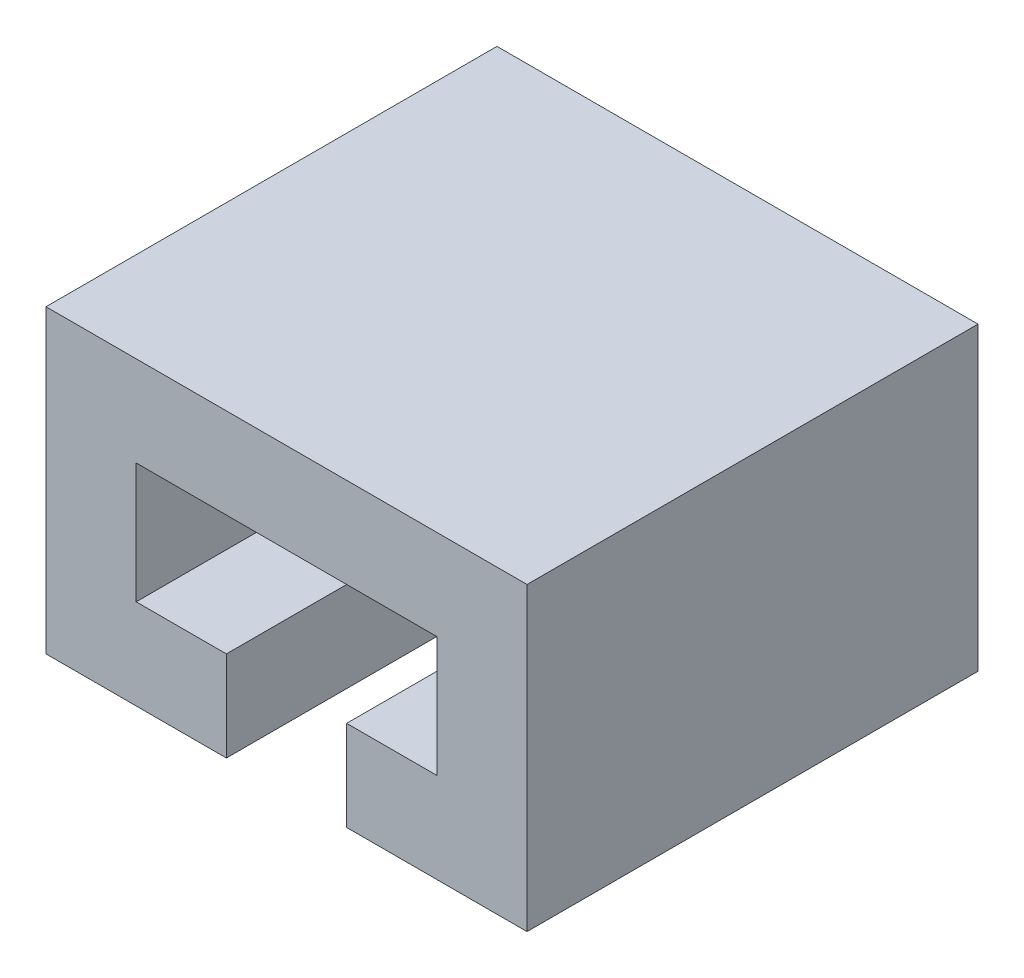
ISO-10303-21;
HEADER;
FILE_DESCRIPTION(('STEP AP214'),'2;1');
FILE_NAME('part.step','',(''),(''),'','','');
FILE_SCHEMA(('AUTOMOTIVE_DESIGN { 1 0 10303 214 1 1 1 1 }'));
ENDSEC;
DATA;
#1=APPLICATION_CONTEXT('core data for automotive mechanical design processes');
#2=APPLICATION_PROTOCOL_DEFINITION('international standard','automotive_design',2000,#1);
#3=PRODUCT_CONTEXT('',#1,'mechanical');
#4=PRODUCT('Part','Part','',(#3));
#5=PRODUCT_RELATED_PRODUCT_CATEGORY('part','',(#4));
#6=PRODUCT_DEFINITION_FORMATION('','',#4);
#7=PRODUCT_DEFINITION_CONTEXT('part definition',#1,'design');
#8=PRODUCT_DEFINITION('design','',#6,#7);
#9=PRODUCT_DEFINITION_SHAPE('','',#8);
#10=(LENGTH_UNIT() NAMED_UNIT(*) SI_UNIT(.MILLI.,.METRE.));
#11=(NAMED_UNIT(*) PLANE_ANGLE_UNIT() SI_UNIT($,.RADIAN.));
#12=(NAMED_UNIT(*) SI_UNIT($,.STERADIAN.) SOLID_ANGLE_UNIT());
#13=UNCERTAINTY_MEASURE_WITH_UNIT(LENGTH_MEASURE(1.E-05),#10,'distance_accuracy_value','');
#14=(GEOMETRIC_REPRESENTATION_CONTEXT(3) GLOBAL_UNCERTAINTY_ASSIGNED_CONTEXT((#13)) GLOBAL_UNIT_ASSIGNED_CONTEXT((#10,
#11,#12)) REPRESENTATION_CONTEXT('',''));
#15=CARTESIAN_POINT('',(0.,0.,0.));
#16=DIRECTION('',(0.,0.,1.));
#17=DIRECTION('',(1.,0.,0.));
#18=AXIS2_PLACEMENT_3D('',#15,#16,#17);
#19=CARTESIAN_POINT('',(0.,-10.,15.));
#20=DIRECTION('',(1.,0.,0.));
#21=DIRECTION('',(0.,0.,-1.));
#22=AXIS2_PLACEMENT_3D('',#19,#20,#21);
#23=PLANE('',#22);
#24=DIRECTION('',(0.,-1.,0.));
#25=VECTOR('',#24,1.);
#26=CARTESIAN_POINT('',(0.,-10.,0.));
#27=LINE('',#26,#25);
#28=CARTESIAN_POINT('',(0.,0.,0.));
#29=VERTEX_POINT('',#28);
#30=CARTESIAN_POINT('',(0.,-10.,0.));
#31=VERTEX_POINT('',#30);
#32=EDGE_CURVE('E168',#29,#31,#27,.T.);
#33=ORIENTED_EDGE('',*,*,#32,.T.);
#34=DIRECTION('',(0.,0.,-1.));
#35=VECTOR('',#34,1.);
#36=CARTESIAN_POINT('',(0.,-10.,15.));
#37=LINE('',#36,#35);
#38=CARTESIAN_POINT('',(0.,-10.,15.));
#39=VERTEX_POINT('',#38);
#40=EDGE_CURVE('E11',#39,#31,#37,.T.);
#41=ORIENTED_EDGE('',*,*,#40,.F.);
#42=DIRECTION('',(0.,-1.,0.));
#43=VECTOR('',#42,1.);
#44=CARTESIAN_POINT('',(0.,-10.,15.));
#45=LINE('',#44,#43);
#46=CARTESIAN_POINT('',(0.,0.,15.));
#47=VERTEX_POINT('',#46);
#48=EDGE_CURVE('E202',#47,#39,#45,.T.);
#49=ORIENTED_EDGE('',*,*,#48,.F.);
#50=DIRECTION('',(0.,0.,-1.));
#51=VECTOR('',#50,1.);
#52=CARTESIAN_POINT('',(0.,0.,15.));
#53=LINE('',#52,#51);
#54=EDGE_CURVE('E164',#47,#29,#53,.T.);
#55=ORIENTED_EDGE('',*,*,#54,.T.);
#56=EDGE_LOOP('',(#33,#41,#49,#55));
#57=FACE_BOUND('',#56,.T.);
#58=ADVANCED_FACE('F43',(#57),#23,.F.);
#59=CARTESIAN_POINT('',(6.,-10.,15.));
#60=DIRECTION('',(0.,1.,0.));
#61=DIRECTION('',(0.,0.,1.));
#62=AXIS2_PLACEMENT_3D('',#59,#60,#61);
#63=PLANE('',#62);
#64=DIRECTION('',(1.,0.,0.));
#65=VECTOR('',#64,1.);
#66=CARTESIAN_POINT('',(6.,-10.,0.));
#67=LINE('',#66,#65);
#68=CARTESIAN_POINT('',(6.,-10.,0.));
#69=VERTEX_POINT('',#68);
#70=EDGE_CURVE('E172',#31,#69,#67,.T.);
#71=ORIENTED_EDGE('',*,*,#70,.T.);
#72=DIRECTION('',(0.,0.,-1.));
#73=VECTOR('',#72,1.);
#74=CARTESIAN_POINT('',(6.,-10.,15.));
#75=LINE('',#74,#73);
#76=CARTESIAN_POINT('',(6.,-10.,15.));
#77=VERTEX_POINT('',#76);
#78=EDGE_CURVE('E52',#77,#69,#75,.T.);
#79=ORIENTED_EDGE('',*,*,#78,.F.);
#80=DIRECTION('',(1.,0.,0.));
#81=VECTOR('',#80,1.);
#82=CARTESIAN_POINT('',(6.,-10.,15.));
#83=LINE('',#82,#81);
#84=EDGE_CURVE('E115',#39,#77,#83,.T.);
#85=ORIENTED_EDGE('',*,*,#84,.F.);
#86=ORIENTED_EDGE('',*,*,#40,.T.);
#87=EDGE_LOOP('',(#71,#79,#85,#86));
#88=FACE_BOUND('',#87,.T.);
#89=ADVANCED_FACE('F296',(#88),#63,.F.);
#90=CARTESIAN_POINT('',(6.,-7.,15.));
#91=DIRECTION('',(-1.,0.,0.));
#92=DIRECTION('',(0.,-1.,0.));
#93=AXIS2_PLACEMENT_3D('',#90,#91,#92);
#94=PLANE('',#93);
#95=DIRECTION('',(0.,1.,0.));
#96=VECTOR('',#95,1.);
#97=CARTESIAN_POINT('',(6.,-7.,0.));
#98=LINE('',#97,#96);
#99=CARTESIAN_POINT('',(6.,-7.,0.));
#100=VERTEX_POINT('',#99);
#101=EDGE_CURVE('E175',#69,#100,#98,.T.);
#102=ORIENTED_EDGE('',*,*,#101,.T.);
#103=DIRECTION('',(0.,0.,-1.));
#104=VECTOR('',#103,1.);
#105=CARTESIAN_POINT('',(6.,-7.,15.));
#106=LINE('',#105,#104);
#107=CARTESIAN_POINT('',(6.,-7.,15.));
#108=VERTEX_POINT('',#107);
#109=EDGE_CURVE('E229',#108,#100,#106,.T.);
#110=ORIENTED_EDGE('',*,*,#109,.F.);
#111=DIRECTION('',(0.,1.,0.));
#112=VECTOR('',#111,1.);
#113=CARTESIAN_POINT('',(6.,-7.,15.));
#114=LINE('',#113,#112);
#115=EDGE_CURVE('E239',#77,#108,#114,.T.);
#116=ORIENTED_EDGE('',*,*,#115,.F.);
#117=ORIENTED_EDGE('',*,*,#78,.T.);
#118=EDGE_LOOP('',(#102,#110,#116,#117));
#119=FACE_BOUND('',#118,.T.);
#120=ADVANCED_FACE('F237',(#119),#94,.F.);
#121=CARTESIAN_POINT('',(3.,-7.,15.));
#122=DIRECTION('',(0.,-1.,0.));
#123=DIRECTION('',(1.,0.,0.));
#124=AXIS2_PLACEMENT_3D('',#121,#122,#123);
#125=PLANE('',#124);
#126=DIRECTION('',(-1.,0.,0.));
#127=VECTOR('',#126,1.);
#128=CARTESIAN_POINT('',(3.,-7.,0.));
#129=LINE('',#128,#127);
#130=CARTESIAN_POINT('',(3.,-7.,0.));
#131=VERTEX_POINT('',#130);
#132=EDGE_CURVE('E178',#100,#131,#129,.T.);
#133=ORIENTED_EDGE('',*,*,#132,.T.);
#134=DIRECTION('',(0.,0.,-1.));
#135=VECTOR('',#134,1.);
#136=CARTESIAN_POINT('',(3.,-7.,15.));
#137=LINE('',#136,#135);
#138=CARTESIAN_POINT('',(3.,-7.,15.));
#139=VERTEX_POINT('',#138);
#140=EDGE_CURVE('E225',#139,#131,#137,.T.);
#141=ORIENTED_EDGE('',*,*,#140,.F.);
#142=DIRECTION('',(-1.,0.,0.));
#143=VECTOR('',#142,1.);
#144=CARTESIAN_POINT('',(3.,-7.,15.));
#145=LINE('',#144,#143);
#146=EDGE_CURVE('E258',#108,#139,#145,.T.);
#147=ORIENTED_EDGE('',*,*,#146,.F.);
#148=ORIENTED_EDGE('',*,*,#109,.T.);
#149=EDGE_LOOP('',(#133,#141,#147,#148));
#150=FACE_BOUND('',#149,.T.);
#151=ADVANCED_FACE('F248',(#150),#125,.F.);
#152=CARTESIAN_POINT('',(3.,-3.,15.));
#153=DIRECTION('',(-1.,0.,0.));
#154=DIRECTION('',(0.,-1.,0.));
#155=AXIS2_PLACEMENT_3D('',#152,#153,#154);
#156=PLANE('',#155);
#157=DIRECTION('',(0.,1.,0.));
#158=VECTOR('',#157,1.);
#159=CARTESIAN_POINT('',(3.,-3.,0.));
#160=LINE('',#159,#158);
#161=CARTESIAN_POINT('',(3.,-3.,0.));
#162=VERTEX_POINT('',#161);
#163=EDGE_CURVE('E181',#131,#162,#160,.T.);
#164=ORIENTED_EDGE('',*,*,#163,.T.);
#165=DIRECTION('',(0.,0.,-1.));
#166=VECTOR('',#165,1.);
#167=CARTESIAN_POINT('',(3.,-3.,15.));
#168=LINE('',#167,#166);
#169=CARTESIAN_POINT('',(3.,-3.,15.));
#170=VERTEX_POINT('',#169);
#171=EDGE_CURVE('E221',#170,#162,#168,.T.);
#172=ORIENTED_EDGE('',*,*,#171,.F.);
#173=DIRECTION('',(0.,1.,0.));
#174=VECTOR('',#173,1.);
#175=CARTESIAN_POINT('',(3.,-3.,15.));
#176=LINE('',#175,#174);
#177=EDGE_CURVE('E254',#139,#170,#176,.T.);
#178=ORIENTED_EDGE('',*,*,#177,.F.);
#179=ORIENTED_EDGE('',*,*,#140,.T.);
#180=EDGE_LOOP('',(#164,#172,#178,#179));
#181=FACE_BOUND('',#180,.T.);
#182=ADVANCED_FACE('F252',(#181),#156,.F.);
#183=CARTESIAN_POINT('',(13.,-3.,15.));
#184=DIRECTION('',(0.,1.,0.));
#185=DIRECTION('',(-1.,0.,0.));
#186=AXIS2_PLACEMENT_3D('',#183,#184,#185);
#187=PLANE('',#186);
#188=DIRECTION('',(1.,0.,0.));
#189=VECTOR('',#188,1.);
#190=CARTESIAN_POINT('',(13.,-3.,0.));
#191=LINE('',#190,#189);
#192=CARTESIAN_POINT('',(13.,-3.,0.));
#193=VERTEX_POINT('',#192);
#194=EDGE_CURVE('E184',#162,#193,#191,.T.);
#195=ORIENTED_EDGE('',*,*,#194,.T.);
#196=DIRECTION('',(0.,0.,-1.));
#197=VECTOR('',#196,1.);
#198=CARTESIAN_POINT('',(13.,-3.,15.));
#199=LINE('',#198,#197);
#200=CARTESIAN_POINT('',(13.,-3.,15.));
#201=VERTEX_POINT('',#200);
#202=EDGE_CURVE('E217',#201,#193,#199,.T.);
#203=ORIENTED_EDGE('',*,*,#202,.F.);
#204=DIRECTION('',(1.,0.,0.));
#205=VECTOR('',#204,1.);
#206=CARTESIAN_POINT('',(13.,-3.,15.));
#207=LINE('',#206,#205);
#208=EDGE_CURVE('E257',#170,#201,#207,.T.);
#209=ORIENTED_EDGE('',*,*,#208,.F.);
#210=ORIENTED_EDGE('',*,*,#171,.T.);
#211=EDGE_LOOP('',(#195,#203,#209,#210));
#212=FACE_BOUND('',#211,.T.);
#213=ADVANCED_FACE('F309',(#212),#187,.F.);
#214=CARTESIAN_POINT('',(13.,-7.,15.));
#215=DIRECTION('',(1.,0.,0.));
#216=DIRECTION('',(0.,0.,-1.));
#217=AXIS2_PLACEMENT_3D('',#214,#215,#216);
#218=PLANE('',#217);
#219=DIRECTION('',(0.,-1.,0.));
#220=VECTOR('',#219,1.);
#221=CARTESIAN_POINT('',(13.,-7.,0.));
#222=LINE('',#221,#220);
#223=CARTESIAN_POINT('',(13.,-7.,0.));
#224=VERTEX_POINT('',#223);
#225=EDGE_CURVE('E187',#193,#224,#222,.T.);
#226=ORIENTED_EDGE('',*,*,#225,.T.);
#227=DIRECTION('',(0.,0.,-1.));
#228=VECTOR('',#227,1.);
#229=CARTESIAN_POINT('',(13.,-7.,15.));
#230=LINE('',#229,#228);
#231=CARTESIAN_POINT('',(13.,-7.,15.));
#232=VERTEX_POINT('',#231);
#233=EDGE_CURVE('E213',#232,#224,#230,.T.);
#234=ORIENTED_EDGE('',*,*,#233,.F.);
#235=DIRECTION('',(0.,-1.,0.));
#236=VECTOR('',#235,1.);
#237=CARTESIAN_POINT('',(13.,-7.,15.));
#238=LINE('',#237,#236);
#239=EDGE_CURVE('E262',#201,#232,#238,.T.);
#240=ORIENTED_EDGE('',*,*,#239,.F.);
#241=ORIENTED_EDGE('',*,*,#202,.T.);
#242=EDGE_LOOP('',(#226,#234,#240,#241));
#243=FACE_BOUND('',#242,.T.);
#244=ADVANCED_FACE('F312',(#243),#218,.F.);
#245=CARTESIAN_POINT('',(10.,-7.,15.));
#246=DIRECTION('',(0.,-1.,0.));
#247=DIRECTION('',(0.,0.,-1.));
#248=AXIS2_PLACEMENT_3D('',#245,#246,#247);
#249=PLANE('',#248);
#250=DIRECTION('',(-1.,0.,0.));
#251=VECTOR('',#250,1.);
#252=CARTESIAN_POINT('',(10.,-7.,0.));
#253=LINE('',#252,#251);
#254=CARTESIAN_POINT('',(10.,-7.,0.));
#255=VERTEX_POINT('',#254);
#256=EDGE_CURVE('E190',#224,#255,#253,.T.);
#257=ORIENTED_EDGE('',*,*,#256,.T.);
#258=DIRECTION('',(0.,0.,-1.));
#259=VECTOR('',#258,1.);
#260=CARTESIAN_POINT('',(10.,-7.,15.));
#261=LINE('',#260,#259);
#262=CARTESIAN_POINT('',(10.,-7.,15.));
#263=VERTEX_POINT('',#262);
#264=EDGE_CURVE('E209',#263,#255,#261,.T.);
#265=ORIENTED_EDGE('',*,*,#264,.F.);
#266=DIRECTION('',(-1.,0.,0.));
#267=VECTOR('',#266,1.);
#268=CARTESIAN_POINT('',(10.,-7.,15.));
#269=LINE('',#268,#267);
#270=EDGE_CURVE('E269',#232,#263,#269,.T.);
#271=ORIENTED_EDGE('',*,*,#270,.F.);
#272=ORIENTED_EDGE('',*,*,#233,.T.);
#273=EDGE_LOOP('',(#257,#265,#271,#272));
#274=FACE_BOUND('',#273,.T.);
#275=ADVANCED_FACE('F277',(#274),#249,.F.);
#276=CARTESIAN_POINT('',(10.,-10.,15.));
#277=DIRECTION('',(1.,0.,0.));
#278=DIRECTION('',(0.,0.,-1.));
#279=AXIS2_PLACEMENT_3D('',#276,#277,#278);
#280=PLANE('',#279);
#281=DIRECTION('',(0.,-1.,0.));
#282=VECTOR('',#281,1.);
#283=CARTESIAN_POINT('',(10.,-10.,0.));
#284=LINE('',#283,#282);
#285=CARTESIAN_POINT('',(10.,-10.,0.));
#286=VERTEX_POINT('',#285);
#287=EDGE_CURVE('E193',#255,#286,#284,.T.);
#288=ORIENTED_EDGE('',*,*,#287,.T.);
#289=DIRECTION('',(0.,0.,-1.));
#290=VECTOR('',#289,1.);
#291=CARTESIAN_POINT('',(10.,-10.,15.));
#292=LINE('',#291,#290);
#293=CARTESIAN_POINT('',(10.,-10.,15.));
#294=VERTEX_POINT('',#293);
#295=EDGE_CURVE('E157',#294,#286,#292,.T.);
#296=ORIENTED_EDGE('',*,*,#295,.F.);
#297=DIRECTION('',(0.,-1.,0.));
#298=VECTOR('',#297,1.);
#299=CARTESIAN_POINT('',(10.,-10.,15.));
#300=LINE('',#299,#298);
#301=EDGE_CURVE('E146',#263,#294,#300,.T.);
#302=ORIENTED_EDGE('',*,*,#301,.F.);
#303=ORIENTED_EDGE('',*,*,#264,.T.);
#304=EDGE_LOOP('',(#288,#296,#302,#303));
#305=FACE_BOUND('',#304,.T.);
#306=ADVANCED_FACE('F281',(#305),#280,.F.);
#307=CARTESIAN_POINT('',(16.,-10.,15.));
#308=DIRECTION('',(0.,1.,0.));
#309=DIRECTION('',(0.,0.,1.));
#310=AXIS2_PLACEMENT_3D('',#307,#308,#309);
#311=PLANE('',#310);
#312=DIRECTION('',(1.,0.,0.));
#313=VECTOR('',#312,1.);
#314=CARTESIAN_POINT('',(16.,-10.,0.));
#315=LINE('',#314,#313);
#316=CARTESIAN_POINT('',(16.,-10.,0.));
#317=VERTEX_POINT('',#316);
#318=EDGE_CURVE('E155',#286,#317,#315,.T.);
#319=ORIENTED_EDGE('',*,*,#318,.T.);
#320=DIRECTION('',(0.,0.,-1.));
#321=VECTOR('',#320,1.);
#322=CARTESIAN_POINT('',(16.,-10.,15.));
#323=LINE('',#322,#321);
#324=CARTESIAN_POINT('',(16.,-10.,15.));
#325=VERTEX_POINT('',#324);
#326=EDGE_CURVE('E152',#325,#317,#323,.T.);
#327=ORIENTED_EDGE('',*,*,#326,.F.);
#328=DIRECTION('',(1.,0.,0.));
#329=VECTOR('',#328,1.);
#330=CARTESIAN_POINT('',(16.,-10.,15.));
#331=LINE('',#330,#329);
#332=EDGE_CURVE('E140',#294,#325,#331,.T.);
#333=ORIENTED_EDGE('',*,*,#332,.F.);
#334=ORIENTED_EDGE('',*,*,#295,.T.);
#335=EDGE_LOOP('',(#319,#327,#333,#334));
#336=FACE_BOUND('',#335,.T.);
#337=ADVANCED_FACE('F153',(#336),#311,.F.);
#338=CARTESIAN_POINT('',(16.,0.,15.));
#339=DIRECTION('',(-1.,0.,0.));
#340=DIRECTION('',(0.,0.,1.));
#341=AXIS2_PLACEMENT_3D('',#338,#339,#340);
#342=PLANE('',#341);
#343=DIRECTION('',(0.,1.,0.));
#344=VECTOR('',#343,1.);
#345=CARTESIAN_POINT('',(16.,0.,0.));
#346=LINE('',#345,#344);
#347=CARTESIAN_POINT('',(16.,0.,0.));
#348=VERTEX_POINT('',#347);
#349=EDGE_CURVE('E101',#317,#348,#346,.T.);
#350=ORIENTED_EDGE('',*,*,#349,.T.);
#351=DIRECTION('',(0.,0.,-1.));
#352=VECTOR('',#351,1.);
#353=CARTESIAN_POINT('',(16.,0.,15.));
#354=LINE('',#353,#352);
#355=CARTESIAN_POINT('',(16.,0.,15.));
#356=VERTEX_POINT('',#355);
#357=EDGE_CURVE('E158',#356,#348,#354,.T.);
#358=ORIENTED_EDGE('',*,*,#357,.F.);
#359=DIRECTION('',(0.,1.,0.));
#360=VECTOR('',#359,1.);
#361=CARTESIAN_POINT('',(16.,0.,15.));
#362=LINE('',#361,#360);
#363=EDGE_CURVE('E144',#325,#356,#362,.T.);
#364=ORIENTED_EDGE('',*,*,#363,.F.);
#365=ORIENTED_EDGE('',*,*,#326,.T.);
#366=EDGE_LOOP('',(#350,#358,#364,#365));
#367=FACE_BOUND('',#366,.T.);
#368=ADVANCED_FACE('F160',(#367),#342,.F.);
#369=CARTESIAN_POINT('',(0.,0.,15.));
#370=DIRECTION('',(0.,-1.,0.));
#371=DIRECTION('',(0.,0.,-1.));
#372=AXIS2_PLACEMENT_3D('',#369,#370,#371);
#373=PLANE('',#372);
#374=DIRECTION('',(-1.,0.,0.));
#375=VECTOR('',#374,1.);
#376=CARTESIAN_POINT('',(0.,0.,0.));
#377=LINE('',#376,#375);
#378=EDGE_CURVE('E107',#348,#29,#377,.T.);
#379=ORIENTED_EDGE('',*,*,#378,.T.);
#380=ORIENTED_EDGE('',*,*,#54,.F.);
#381=DIRECTION('',(-1.,0.,0.));
#382=VECTOR('',#381,1.);
#383=CARTESIAN_POINT('',(0.,0.,15.));
#384=LINE('',#383,#382);
#385=EDGE_CURVE('E60',#356,#47,#384,.T.);
#386=ORIENTED_EDGE('',*,*,#385,.F.);
#387=ORIENTED_EDGE('',*,*,#357,.T.);
#388=EDGE_LOOP('',(#379,#380,#386,#387));
#389=FACE_BOUND('',#388,.T.);
#390=ADVANCED_FACE('F285',(#389),#373,.F.);
#391=CARTESIAN_POINT('',(0.,0.,15.));
#392=DIRECTION('',(0.,0.,-1.));
#393=DIRECTION('',(-1.,0.,0.));
#394=AXIS2_PLACEMENT_3D('',#391,#392,#393);
#395=PLANE('',#394);
#396=ORIENTED_EDGE('',*,*,#48,.T.);
#397=ORIENTED_EDGE('',*,*,#84,.T.);
#398=ORIENTED_EDGE('',*,*,#115,.T.);
#399=ORIENTED_EDGE('',*,*,#146,.T.);
#400=ORIENTED_EDGE('',*,*,#177,.T.);
#401=ORIENTED_EDGE('',*,*,#208,.T.);
#402=ORIENTED_EDGE('',*,*,#239,.T.);
#403=ORIENTED_EDGE('',*,*,#270,.T.);
#404=ORIENTED_EDGE('',*,*,#301,.T.);
#405=ORIENTED_EDGE('',*,*,#332,.T.);
#406=ORIENTED_EDGE('',*,*,#363,.T.);
#407=ORIENTED_EDGE('',*,*,#385,.T.);
#408=EDGE_LOOP('',(#396,#397,#398,#399,#400,#401,#402,#403,#404,#405,#406,#407));
#409=FACE_BOUND('',#408,.T.);
#410=ADVANCED_FACE('F142',(#409),#395,.F.);
#411=CARTESIAN_POINT('',(0.,0.,0.));
#412=DIRECTION('',(0.,0.,-1.));
#413=DIRECTION('',(-1.,0.,0.));
#414=AXIS2_PLACEMENT_3D('',#411,#412,#413);
#415=PLANE('',#414);
#416=ORIENTED_EDGE('',*,*,#32,.F.);
#417=ORIENTED_EDGE('',*,*,#378,.F.);
#418=ORIENTED_EDGE('',*,*,#349,.F.);
#419=ORIENTED_EDGE('',*,*,#318,.F.);
#420=ORIENTED_EDGE('',*,*,#287,.F.);
#421=ORIENTED_EDGE('',*,*,#256,.F.);
#422=ORIENTED_EDGE('',*,*,#225,.F.);
#423=ORIENTED_EDGE('',*,*,#194,.F.);
#424=ORIENTED_EDGE('',*,*,#163,.F.);
#425=ORIENTED_EDGE('',*,*,#132,.F.);
#426=ORIENTED_EDGE('',*,*,#101,.F.);
#427=ORIENTED_EDGE('',*,*,#70,.F.);
#428=EDGE_LOOP('',(#416,#417,#418,#419,#420,#421,#422,#423,#424,#425,#426,#427));
#429=FACE_BOUND('',#428,.T.);
#430=ADVANCED_FACE('F243',(#429),#415,.T.);
#431=CLOSED_SHELL('',(#58,#89,#120,#151,#182,#213,#244,#275,#306,#337,#368,#390,#410,#430));
#432=MANIFOLD_SOLID_BREP('B2',#431);
#433=ADVANCED_BREP_SHAPE_REPRESENTATION('',(#18,#432),#14);
#434=SHAPE_DEFINITION_REPRESENTATION(#9,#433);
ENDSEC;
END-ISO-10303-21;
